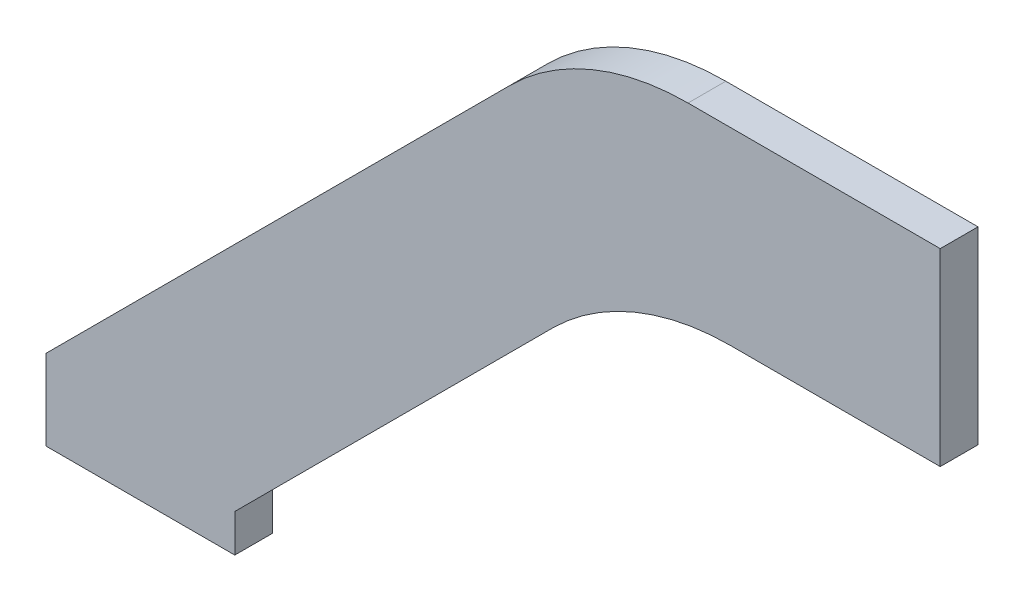
ISO-10303-21;
HEADER;
FILE_DESCRIPTION(('STEP AP214'),'2;1');
FILE_NAME('part.step','',(''),(''),'','','');
FILE_SCHEMA(('AUTOMOTIVE_DESIGN { 1 0 10303 214 1 1 1 1 }'));
ENDSEC;
DATA;
#1=APPLICATION_CONTEXT('core data for automotive mechanical design processes');
#2=APPLICATION_PROTOCOL_DEFINITION('international standard','automotive_design',2000,#1);
#3=PRODUCT_CONTEXT('',#1,'mechanical');
#4=PRODUCT('Part','Part','',(#3));
#5=PRODUCT_RELATED_PRODUCT_CATEGORY('part','',(#4));
#6=PRODUCT_DEFINITION_FORMATION('','',#4);
#7=PRODUCT_DEFINITION_CONTEXT('part definition',#1,'design');
#8=PRODUCT_DEFINITION('design','',#6,#7);
#9=PRODUCT_DEFINITION_SHAPE('','',#8);
#10=(LENGTH_UNIT() NAMED_UNIT(*) SI_UNIT(.MILLI.,.METRE.));
#11=(NAMED_UNIT(*) PLANE_ANGLE_UNIT() SI_UNIT($,.RADIAN.));
#12=(NAMED_UNIT(*) SI_UNIT($,.STERADIAN.) SOLID_ANGLE_UNIT());
#13=UNCERTAINTY_MEASURE_WITH_UNIT(LENGTH_MEASURE(1.E-05),#10,'distance_accuracy_value','');
#14=(GEOMETRIC_REPRESENTATION_CONTEXT(3) GLOBAL_UNCERTAINTY_ASSIGNED_CONTEXT((#13)) GLOBAL_UNIT_ASSIGNED_CONTEXT((#10,
#11,#12)) REPRESENTATION_CONTEXT('',''));
#15=CARTESIAN_POINT('',(0.,0.,0.));
#16=DIRECTION('',(0.,0.,1.));
#17=DIRECTION('',(1.,0.,0.));
#18=AXIS2_PLACEMENT_3D('',#15,#16,#17);
#19=CARTESIAN_POINT('',(1.5,0.3,0.15));
#20=DIRECTION('',(-0.707106781186547,0.707106781186549,0.));
#21=DIRECTION('',(-0.707106781186549,-0.707106781186547,0.));
#22=AXIS2_PLACEMENT_3D('',#19,#20,#21);
#23=PLANE('',#22);
#24=DIRECTION('',(0.707106781186549,0.707106781186547,0.));
#25=VECTOR('',#24,1.);
#26=CARTESIAN_POINT('',(1.5,0.3,-0.15));
#27=LINE('',#26,#25);
#28=CARTESIAN_POINT('',(1.5,0.3,-0.15));
#29=VERTEX_POINT('',#28);
#30=CARTESIAN_POINT('',(4.02548339959391,2.8254833995939,-0.15));
#31=VERTEX_POINT('',#30);
#32=EDGE_CURVE('E170',#29,#31,#27,.T.);
#33=ORIENTED_EDGE('',*,*,#32,.T.);
#34=DIRECTION('',(0.,0.,-1.));
#35=VECTOR('',#34,1.);
#36=CARTESIAN_POINT('',(4.02548339959391,2.8254833995939,0.15));
#37=LINE('',#36,#35);
#38=CARTESIAN_POINT('',(4.02548339959391,2.8254833995939,0.15));
#39=VERTEX_POINT('',#38);
#40=EDGE_CURVE('E204',#31,#39,#37,.F.);
#41=ORIENTED_EDGE('',*,*,#40,.T.);
#42=DIRECTION('',(0.707106781186549,0.707106781186547,0.));
#43=VECTOR('',#42,1.);
#44=CARTESIAN_POINT('',(1.5,0.3,0.15));
#45=LINE('',#44,#43);
#46=CARTESIAN_POINT('',(1.5,0.3,0.15));
#47=VERTEX_POINT('',#46);
#48=EDGE_CURVE('E137',#47,#39,#45,.T.);
#49=ORIENTED_EDGE('',*,*,#48,.F.);
#50=DIRECTION('',(0.,0.,-1.));
#51=VECTOR('',#50,1.);
#52=CARTESIAN_POINT('',(1.5,0.3,0.15));
#53=LINE('',#52,#51);
#54=EDGE_CURVE('E169',#47,#29,#53,.T.);
#55=ORIENTED_EDGE('',*,*,#54,.T.);
#56=EDGE_LOOP('',(#33,#41,#49,#55));
#57=FACE_BOUND('',#56,.T.);
#58=ADVANCED_FACE('F39',(#57),#23,.F.);
#59=CARTESIAN_POINT('',(4.61126983722081,3.4112698372208,0.15));
#60=DIRECTION('',(0.,1.,0.));
#61=DIRECTION('',(-1.,0.,0.));
#62=AXIS2_PLACEMENT_3D('',#59,#60,#61);
#63=PLANE('',#62);
#64=DIRECTION('',(1.,0.,0.));
#65=VECTOR('',#64,1.);
#66=CARTESIAN_POINT('',(4.61126983722081,3.4112698372208,0.15));
#67=LINE('',#66,#65);
#68=CARTESIAN_POINT('',(5.439696961967,3.4112698372208,0.15));
#69=VERTEX_POINT('',#68);
#70=CARTESIAN_POINT('',(7.105,3.4112698372208,0.15));
#71=VERTEX_POINT('',#70);
#72=EDGE_CURVE('E126',#69,#71,#67,.T.);
#73=ORIENTED_EDGE('',*,*,#72,.F.);
#74=DIRECTION('',(0.,0.,-1.));
#75=VECTOR('',#74,1.);
#76=CARTESIAN_POINT('',(5.439696961967,3.4112698372208,-0.15));
#77=LINE('',#76,#75);
#78=CARTESIAN_POINT('',(5.439696961967,3.4112698372208,-0.15));
#79=VERTEX_POINT('',#78);
#80=EDGE_CURVE('E146',#69,#79,#77,.T.);
#81=ORIENTED_EDGE('',*,*,#80,.T.);
#82=DIRECTION('',(1.,0.,0.));
#83=VECTOR('',#82,1.);
#84=CARTESIAN_POINT('',(4.61126983722081,3.4112698372208,-0.15));
#85=LINE('',#84,#83);
#86=CARTESIAN_POINT('',(7.105,3.4112698372208,-0.15));
#87=VERTEX_POINT('',#86);
#88=EDGE_CURVE('E143',#79,#87,#85,.T.);
#89=ORIENTED_EDGE('',*,*,#88,.T.);
#90=DIRECTION('',(0.,0.,-1.));
#91=VECTOR('',#90,1.);
#92=CARTESIAN_POINT('',(7.105,3.4112698372208,0.15));
#93=LINE('',#92,#91);
#94=EDGE_CURVE('E140',#71,#87,#93,.T.);
#95=ORIENTED_EDGE('',*,*,#94,.F.);
#96=EDGE_LOOP('',(#73,#81,#89,#95));
#97=FACE_BOUND('',#96,.T.);
#98=ADVANCED_FACE('F141',(#97),#63,.F.);
#99=CARTESIAN_POINT('',(7.105,3.4112698372208,0.15));
#100=DIRECTION('',(-1.,0.,0.));
#101=DIRECTION('',(0.,0.,1.));
#102=AXIS2_PLACEMENT_3D('',#99,#100,#101);
#103=PLANE('',#102);
#104=DIRECTION('',(0.,1.,0.));
#105=VECTOR('',#104,1.);
#106=CARTESIAN_POINT('',(7.105,3.4112698372208,-0.15));
#107=LINE('',#106,#105);
#108=CARTESIAN_POINT('',(7.105,4.9112698372208,-0.15));
#109=VERTEX_POINT('',#108);
#110=EDGE_CURVE('E175',#87,#109,#107,.T.);
#111=ORIENTED_EDGE('',*,*,#110,.T.);
#112=DIRECTION('',(0.,0.,-1.));
#113=VECTOR('',#112,1.);
#114=CARTESIAN_POINT('',(7.105,4.9112698372208,0.15));
#115=LINE('',#114,#113);
#116=CARTESIAN_POINT('',(7.105,4.9112698372208,0.15));
#117=VERTEX_POINT('',#116);
#118=EDGE_CURVE('E147',#117,#109,#115,.T.);
#119=ORIENTED_EDGE('',*,*,#118,.F.);
#120=DIRECTION('',(0.,1.,0.));
#121=VECTOR('',#120,1.);
#122=CARTESIAN_POINT('',(7.105,3.4112698372208,0.15));
#123=LINE('',#122,#121);
#124=EDGE_CURVE('E130',#71,#117,#123,.T.);
#125=ORIENTED_EDGE('',*,*,#124,.F.);
#126=ORIENTED_EDGE('',*,*,#94,.T.);
#127=EDGE_LOOP('',(#111,#119,#125,#126));
#128=FACE_BOUND('',#127,.T.);
#129=ADVANCED_FACE('F149',(#128),#103,.F.);
#130=CARTESIAN_POINT('',(7.105,4.9112698372208,0.15));
#131=DIRECTION('',(0.,-1.,0.));
#132=DIRECTION('',(0.,0.,-1.));
#133=AXIS2_PLACEMENT_3D('',#130,#131,#132);
#134=PLANE('',#133);
#135=DIRECTION('',(-1.,0.,0.));
#136=VECTOR('',#135,1.);
#137=CARTESIAN_POINT('',(7.105,4.9112698372208,-0.15));
#138=LINE('',#137,#136);
#139=CARTESIAN_POINT('',(5.10121933088198,4.9112698372208,-0.15));
#140=VERTEX_POINT('',#139);
#141=EDGE_CURVE('E178',#109,#140,#138,.T.);
#142=ORIENTED_EDGE('',*,*,#141,.T.);
#143=DIRECTION('',(0.,0.,-1.));
#144=VECTOR('',#143,1.);
#145=CARTESIAN_POINT('',(5.10121933088198,4.9112698372208,0.15));
#146=LINE('',#145,#144);
#147=CARTESIAN_POINT('',(5.10121933088198,4.9112698372208,0.15));
#148=VERTEX_POINT('',#147);
#149=EDGE_CURVE('E58',#140,#148,#146,.F.);
#150=ORIENTED_EDGE('',*,*,#149,.T.);
#151=DIRECTION('',(-1.,0.,0.));
#152=VECTOR('',#151,1.);
#153=CARTESIAN_POINT('',(7.105,4.9112698372208,0.15));
#154=LINE('',#153,#152);
#155=EDGE_CURVE('E152',#117,#148,#154,.T.);
#156=ORIENTED_EDGE('',*,*,#155,.F.);
#157=ORIENTED_EDGE('',*,*,#118,.T.);
#158=EDGE_LOOP('',(#142,#150,#156,#157));
#159=FACE_BOUND('',#158,.T.);
#160=ADVANCED_FACE('F243',(#159),#134,.F.);
#161=CARTESIAN_POINT('',(4.27279220613579,4.9112698372208,0.15));
#162=DIRECTION('',(0.707106781186546,-0.707106781186549,0.));
#163=DIRECTION('',(0.707106781186549,0.707106781186546,0.));
#164=AXIS2_PLACEMENT_3D('',#161,#162,#163);
#165=PLANE('',#164);
#166=DIRECTION('',(-0.707106781186549,-0.707106781186546,0.));
#167=VECTOR('',#166,1.);
#168=CARTESIAN_POINT('',(4.27279220613579,4.9112698372208,0.15));
#169=LINE('',#168,#167);
#170=CARTESIAN_POINT('',(3.68700576850889,4.3254833995939,0.15));
#171=VERTEX_POINT('',#170);
#172=CARTESIAN_POINT('',(0.,0.638477631085026,0.15));
#173=VERTEX_POINT('',#172);
#174=EDGE_CURVE('E157',#171,#173,#169,.T.);
#175=ORIENTED_EDGE('',*,*,#174,.F.);
#176=DIRECTION('',(0.,0.,-1.));
#177=VECTOR('',#176,1.);
#178=CARTESIAN_POINT('',(3.68700576850889,4.3254833995939,0.15));
#179=LINE('',#178,#177);
#180=CARTESIAN_POINT('',(3.68700576850889,4.3254833995939,-0.15));
#181=VERTEX_POINT('',#180);
#182=EDGE_CURVE('E207',#171,#181,#179,.T.);
#183=ORIENTED_EDGE('',*,*,#182,.T.);
#184=DIRECTION('',(-0.707106781186549,-0.707106781186546,0.));
#185=VECTOR('',#184,1.);
#186=CARTESIAN_POINT('',(4.27279220613579,4.9112698372208,-0.15));
#187=LINE('',#186,#185);
#188=CARTESIAN_POINT('',(0.,0.638477631085026,-0.15));
#189=VERTEX_POINT('',#188);
#190=EDGE_CURVE('E181',#181,#189,#187,.T.);
#191=ORIENTED_EDGE('',*,*,#190,.T.);
#192=DIRECTION('',(0.,0.,-1.));
#193=VECTOR('',#192,1.);
#194=CARTESIAN_POINT('',(0.,0.638477631085026,0.15));
#195=LINE('',#194,#193);
#196=EDGE_CURVE('E198',#173,#189,#195,.T.);
#197=ORIENTED_EDGE('',*,*,#196,.F.);
#198=EDGE_LOOP('',(#175,#183,#191,#197));
#199=FACE_BOUND('',#198,.T.);
#200=ADVANCED_FACE('F246',(#199),#165,.F.);
#201=CARTESIAN_POINT('',(0.,0.638477631085026,0.15));
#202=DIRECTION('',(1.,0.,0.));
#203=DIRECTION('',(0.,1.,0.));
#204=AXIS2_PLACEMENT_3D('',#201,#202,#203);
#205=PLANE('',#204);
#206=DIRECTION('',(0.,-1.,0.));
#207=VECTOR('',#206,1.);
#208=CARTESIAN_POINT('',(0.,0.638477631085026,-0.15));
#209=LINE('',#208,#207);
#210=CARTESIAN_POINT('',(0.,0.,-0.15));
#211=VERTEX_POINT('',#210);
#212=EDGE_CURVE('E184',#189,#211,#209,.T.);
#213=ORIENTED_EDGE('',*,*,#212,.T.);
#214=DIRECTION('',(0.,0.,-1.));
#215=VECTOR('',#214,1.);
#216=CARTESIAN_POINT('',(0.,0.,0.15));
#217=LINE('',#216,#215);
#218=CARTESIAN_POINT('',(0.,0.,0.15));
#219=VERTEX_POINT('',#218);
#220=EDGE_CURVE('E195',#219,#211,#217,.T.);
#221=ORIENTED_EDGE('',*,*,#220,.F.);
#222=DIRECTION('',(0.,-1.,0.));
#223=VECTOR('',#222,1.);
#224=CARTESIAN_POINT('',(0.,0.638477631085026,0.15));
#225=LINE('',#224,#223);
#226=EDGE_CURVE('E163',#173,#219,#225,.T.);
#227=ORIENTED_EDGE('',*,*,#226,.F.);
#228=ORIENTED_EDGE('',*,*,#196,.T.);
#229=EDGE_LOOP('',(#213,#221,#227,#228));
#230=FACE_BOUND('',#229,.T.);
#231=ADVANCED_FACE('F249',(#230),#205,.F.);
#232=CARTESIAN_POINT('',(0.,0.,0.15));
#233=DIRECTION('',(0.,1.,0.));
#234=DIRECTION('',(0.,0.,1.));
#235=AXIS2_PLACEMENT_3D('',#232,#233,#234);
#236=PLANE('',#235);
#237=DIRECTION('',(1.,0.,0.));
#238=VECTOR('',#237,1.);
#239=CARTESIAN_POINT('',(0.,0.,-0.15));
#240=LINE('',#239,#238);
#241=CARTESIAN_POINT('',(1.5,0.,-0.15));
#242=VERTEX_POINT('',#241);
#243=EDGE_CURVE('E186',#211,#242,#240,.T.);
#244=ORIENTED_EDGE('',*,*,#243,.T.);
#245=DIRECTION('',(0.,0.,-1.));
#246=VECTOR('',#245,1.);
#247=CARTESIAN_POINT('',(1.5,0.,0.15));
#248=LINE('',#247,#246);
#249=CARTESIAN_POINT('',(1.5,0.,0.15));
#250=VERTEX_POINT('',#249);
#251=EDGE_CURVE('E192',#250,#242,#248,.T.);
#252=ORIENTED_EDGE('',*,*,#251,.F.);
#253=DIRECTION('',(1.,0.,0.));
#254=VECTOR('',#253,1.);
#255=CARTESIAN_POINT('',(0.,0.,0.15));
#256=LINE('',#255,#254);
#257=EDGE_CURVE('E165',#219,#250,#256,.T.);
#258=ORIENTED_EDGE('',*,*,#257,.F.);
#259=ORIENTED_EDGE('',*,*,#220,.T.);
#260=EDGE_LOOP('',(#244,#252,#258,#259));
#261=FACE_BOUND('',#260,.T.);
#262=ADVANCED_FACE('F253',(#261),#236,.F.);
#263=CARTESIAN_POINT('',(1.5,0.,0.15));
#264=DIRECTION('',(-1.,0.,0.));
#265=DIRECTION('',(0.,-1.,0.));
#266=AXIS2_PLACEMENT_3D('',#263,#264,#265);
#267=PLANE('',#266);
#268=DIRECTION('',(0.,1.,0.));
#269=VECTOR('',#268,1.);
#270=CARTESIAN_POINT('',(1.5,0.,-0.15));
#271=LINE('',#270,#269);
#272=EDGE_CURVE('E188',#242,#29,#271,.T.);
#273=ORIENTED_EDGE('',*,*,#272,.T.);
#274=ORIENTED_EDGE('',*,*,#54,.F.);
#275=DIRECTION('',(0.,1.,0.));
#276=VECTOR('',#275,1.);
#277=CARTESIAN_POINT('',(1.5,0.,0.15));
#278=LINE('',#277,#276);
#279=EDGE_CURVE('E167',#250,#47,#278,.T.);
#280=ORIENTED_EDGE('',*,*,#279,.F.);
#281=ORIENTED_EDGE('',*,*,#251,.T.);
#282=EDGE_LOOP('',(#273,#274,#280,#281));
#283=FACE_BOUND('',#282,.T.);
#284=ADVANCED_FACE('F257',(#283),#267,.F.);
#285=CARTESIAN_POINT('',(0.,0.,0.15));
#286=DIRECTION('',(0.,0.,-1.));
#287=DIRECTION('',(-1.,0.,0.));
#288=AXIS2_PLACEMENT_3D('',#285,#286,#287);
#289=PLANE('',#288);
#290=ORIENTED_EDGE('',*,*,#155,.T.);
#291=CARTESIAN_POINT('',(5.10121933088198,2.9112698372208,0.15));
#292=DIRECTION('',(0.,0.,-1.));
#293=DIRECTION('',(-1.,0.,0.));
#294=AXIS2_PLACEMENT_3D('',#291,#292,#293);
#295=CIRCLE('',#294,2.);
#296=EDGE_CURVE('E215',#148,#171,#295,.F.);
#297=ORIENTED_EDGE('',*,*,#296,.T.);
#298=ORIENTED_EDGE('',*,*,#174,.T.);
#299=ORIENTED_EDGE('',*,*,#226,.T.);
#300=ORIENTED_EDGE('',*,*,#257,.T.);
#301=ORIENTED_EDGE('',*,*,#279,.T.);
#302=ORIENTED_EDGE('',*,*,#48,.T.);
#303=CARTESIAN_POINT('',(5.439696961967,1.4112698372208,0.15));
#304=DIRECTION('',(0.,0.,-1.));
#305=DIRECTION('',(-1.,0.,0.));
#306=AXIS2_PLACEMENT_3D('',#303,#304,#305);
#307=CIRCLE('',#306,2.);
#308=EDGE_CURVE('E11',#39,#69,#307,.T.);
#309=ORIENTED_EDGE('',*,*,#308,.T.);
#310=ORIENTED_EDGE('',*,*,#72,.T.);
#311=ORIENTED_EDGE('',*,*,#124,.T.);
#312=EDGE_LOOP('',(#290,#297,#298,#299,#300,#301,#302,#309,#310,#311));
#313=FACE_BOUND('',#312,.T.);
#314=ADVANCED_FACE('F128',(#313),#289,.F.);
#315=CARTESIAN_POINT('',(0.,0.,-0.15));
#316=DIRECTION('',(0.,0.,-1.));
#317=DIRECTION('',(-1.,0.,0.));
#318=AXIS2_PLACEMENT_3D('',#315,#316,#317);
#319=PLANE('',#318);
#320=ORIENTED_EDGE('',*,*,#190,.F.);
#321=CARTESIAN_POINT('',(5.10121933088198,2.9112698372208,-0.15));
#322=DIRECTION('',(0.,0.,-1.));
#323=DIRECTION('',(-1.,0.,0.));
#324=AXIS2_PLACEMENT_3D('',#321,#322,#323);
#325=CIRCLE('',#324,2.);
#326=EDGE_CURVE('E67',#181,#140,#325,.T.);
#327=ORIENTED_EDGE('',*,*,#326,.T.);
#328=ORIENTED_EDGE('',*,*,#141,.F.);
#329=ORIENTED_EDGE('',*,*,#110,.F.);
#330=ORIENTED_EDGE('',*,*,#88,.F.);
#331=CARTESIAN_POINT('',(5.439696961967,1.4112698372208,-0.15));
#332=DIRECTION('',(0.,0.,-1.));
#333=DIRECTION('',(-1.,0.,0.));
#334=AXIS2_PLACEMENT_3D('',#331,#332,#333);
#335=CIRCLE('',#334,2.);
#336=EDGE_CURVE('E48',#79,#31,#335,.F.);
#337=ORIENTED_EDGE('',*,*,#336,.T.);
#338=ORIENTED_EDGE('',*,*,#32,.F.);
#339=ORIENTED_EDGE('',*,*,#272,.F.);
#340=ORIENTED_EDGE('',*,*,#243,.F.);
#341=ORIENTED_EDGE('',*,*,#212,.F.);
#342=EDGE_LOOP('',(#320,#327,#328,#329,#330,#337,#338,#339,#340,#341));
#343=FACE_BOUND('',#342,.T.);
#344=ADVANCED_FACE('F219',(#343),#319,.T.);
#345=CARTESIAN_POINT('',(5.439696961967,1.4112698372208,0.15));
#346=DIRECTION('',(0.,0.,1.));
#347=DIRECTION('',(1.,0.,0.));
#348=AXIS2_PLACEMENT_3D('',#345,#346,#347);
#349=CYLINDRICAL_SURFACE('',#348,2.);
#350=ORIENTED_EDGE('',*,*,#308,.F.);
#351=ORIENTED_EDGE('',*,*,#40,.F.);
#352=ORIENTED_EDGE('',*,*,#336,.F.);
#353=ORIENTED_EDGE('',*,*,#80,.F.);
#354=EDGE_LOOP('',(#350,#351,#352,#353));
#355=FACE_BOUND('',#354,.T.);
#356=ADVANCED_FACE('F226',(#355),#349,.F.);
#357=CARTESIAN_POINT('',(5.10121933088198,2.9112698372208,0.15));
#358=DIRECTION('',(0.,0.,-1.));
#359=DIRECTION('',(-1.,0.,0.));
#360=AXIS2_PLACEMENT_3D('',#357,#358,#359);
#361=CYLINDRICAL_SURFACE('',#360,2.);
#362=ORIENTED_EDGE('',*,*,#296,.F.);
#363=ORIENTED_EDGE('',*,*,#149,.F.);
#364=ORIENTED_EDGE('',*,*,#326,.F.);
#365=ORIENTED_EDGE('',*,*,#182,.F.);
#366=EDGE_LOOP('',(#362,#363,#364,#365));
#367=FACE_BOUND('',#366,.T.);
#368=ADVANCED_FACE('F41',(#367),#361,.T.);
#369=CLOSED_SHELL('',(#58,#98,#129,#160,#200,#231,#262,#284,#314,#344,#356,#368));
#370=MANIFOLD_SOLID_BREP('B2',#369);
#371=ADVANCED_BREP_SHAPE_REPRESENTATION('',(#18,#370),#14);
#372=SHAPE_DEFINITION_REPRESENTATION(#9,#371);
ENDSEC;
END-ISO-10303-21;
